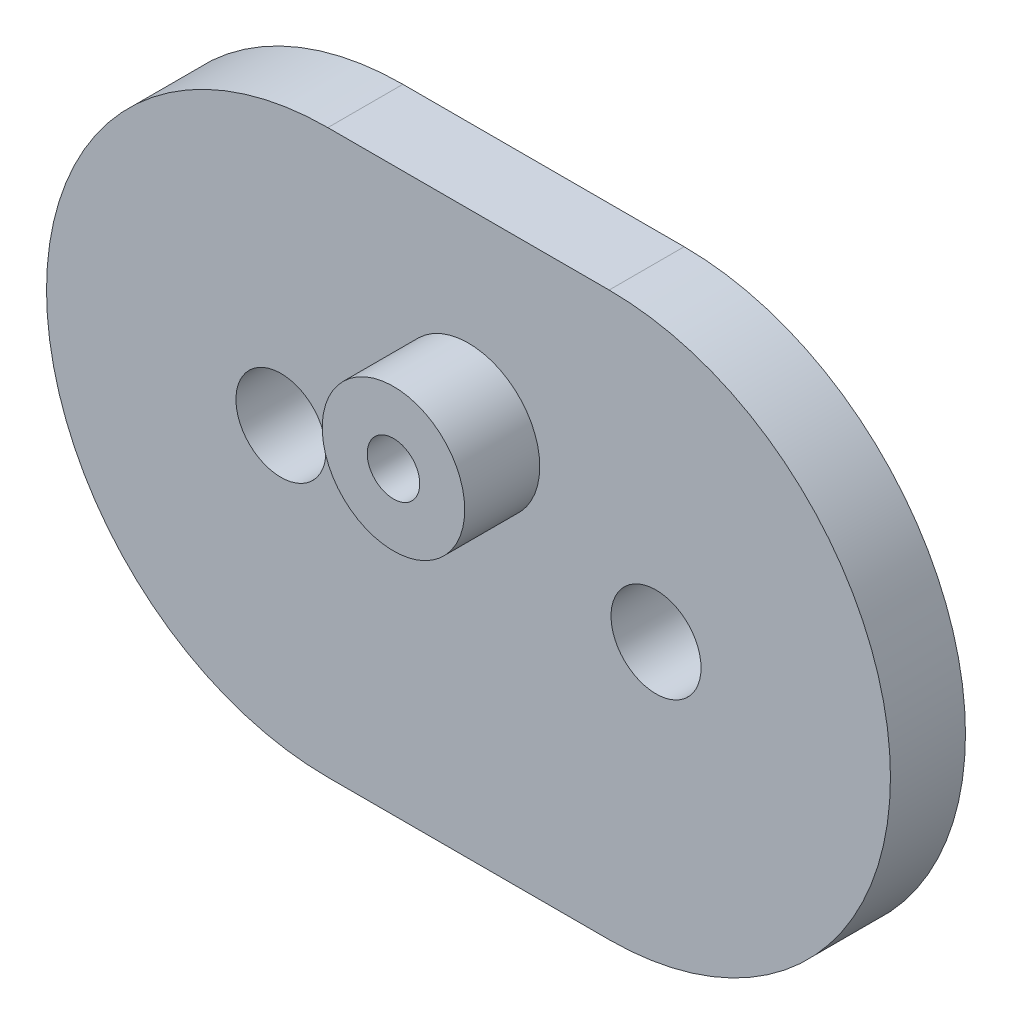
ISO-10303-21;
HEADER;
FILE_DESCRIPTION(('STEP AP214'),'2;1');
FILE_NAME('part.step','',(''),(''),'','','');
FILE_SCHEMA(('AUTOMOTIVE_DESIGN { 1 0 10303 214 1 1 1 1 }'));
ENDSEC;
DATA;
#1=APPLICATION_CONTEXT('core data for automotive mechanical design processes');
#2=APPLICATION_PROTOCOL_DEFINITION('international standard','automotive_design',2000,#1);
#3=PRODUCT_CONTEXT('',#1,'mechanical');
#4=PRODUCT('Part','Part','',(#3));
#5=PRODUCT_RELATED_PRODUCT_CATEGORY('part','',(#4));
#6=PRODUCT_DEFINITION_FORMATION('','',#4);
#7=PRODUCT_DEFINITION_CONTEXT('part definition',#1,'design');
#8=PRODUCT_DEFINITION('design','',#6,#7);
#9=PRODUCT_DEFINITION_SHAPE('','',#8);
#10=(LENGTH_UNIT() NAMED_UNIT(*) SI_UNIT(.MILLI.,.METRE.));
#11=(NAMED_UNIT(*) PLANE_ANGLE_UNIT() SI_UNIT($,.RADIAN.));
#12=(NAMED_UNIT(*) SI_UNIT($,.STERADIAN.) SOLID_ANGLE_UNIT());
#13=UNCERTAINTY_MEASURE_WITH_UNIT(LENGTH_MEASURE(1.E-05),#10,'distance_accuracy_value','');
#14=(GEOMETRIC_REPRESENTATION_CONTEXT(3) GLOBAL_UNCERTAINTY_ASSIGNED_CONTEXT((#13)) GLOBAL_UNIT_ASSIGNED_CONTEXT((#10,
#11,#12)) REPRESENTATION_CONTEXT('',''));
#15=CARTESIAN_POINT('',(0.,0.,0.));
#16=DIRECTION('',(0.,0.,1.));
#17=DIRECTION('',(1.,0.,0.));
#18=AXIS2_PLACEMENT_3D('',#15,#16,#17);
#19=CARTESIAN_POINT('',(0.,-15.,4.));
#20=DIRECTION('',(0.,1.,0.));
#21=DIRECTION('',(0.,0.,1.));
#22=AXIS2_PLACEMENT_3D('',#19,#20,#21);
#23=PLANE('',#22);
#24=DIRECTION('',(1.,0.,0.));
#25=VECTOR('',#24,1.);
#26=CARTESIAN_POINT('',(0.,-15.,0.));
#27=LINE('',#26,#25);
#28=CARTESIAN_POINT('',(-7.5,-15.,0.));
#29=VERTEX_POINT('',#28);
#30=CARTESIAN_POINT('',(7.5,-15.,0.));
#31=VERTEX_POINT('',#30);
#32=EDGE_CURVE('E105',#29,#31,#27,.T.);
#33=ORIENTED_EDGE('',*,*,#32,.T.);
#34=DIRECTION('',(0.,0.,-1.));
#35=VECTOR('',#34,1.);
#36=CARTESIAN_POINT('',(7.5,-15.,4.));
#37=LINE('',#36,#35);
#38=CARTESIAN_POINT('',(7.5,-15.,4.));
#39=VERTEX_POINT('',#38);
#40=EDGE_CURVE('E11',#39,#31,#37,.T.);
#41=ORIENTED_EDGE('',*,*,#40,.F.);
#42=DIRECTION('',(1.,0.,0.));
#43=VECTOR('',#42,1.);
#44=CARTESIAN_POINT('',(0.,-15.,4.));
#45=LINE('',#44,#43);
#46=CARTESIAN_POINT('',(-7.5,-15.,4.));
#47=VERTEX_POINT('',#46);
#48=EDGE_CURVE('E83',#47,#39,#45,.T.);
#49=ORIENTED_EDGE('',*,*,#48,.F.);
#50=DIRECTION('',(0.,0.,-1.));
#51=VECTOR('',#50,1.);
#52=CARTESIAN_POINT('',(-7.5,-15.,4.));
#53=LINE('',#52,#51);
#54=EDGE_CURVE('E94',#47,#29,#53,.T.);
#55=ORIENTED_EDGE('',*,*,#54,.T.);
#56=EDGE_LOOP('',(#33,#41,#49,#55));
#57=FACE_BOUND('',#56,.T.);
#58=ADVANCED_FACE('F35',(#57),#23,.F.);
#59=CARTESIAN_POINT('',(7.5,0.,4.));
#60=DIRECTION('',(0.,0.,-1.));
#61=DIRECTION('',(-1.,0.,0.));
#62=AXIS2_PLACEMENT_3D('',#59,#60,#61);
#63=CYLINDRICAL_SURFACE('',#62,15.);
#64=CARTESIAN_POINT('',(7.5,0.,0.));
#65=DIRECTION('',(0.,0.,1.));
#66=DIRECTION('',(1.,0.,0.));
#67=AXIS2_PLACEMENT_3D('',#64,#65,#66);
#68=CIRCLE('',#67,15.);
#69=CARTESIAN_POINT('',(7.5,15.,0.));
#70=VERTEX_POINT('',#69);
#71=EDGE_CURVE('E88',#31,#70,#68,.T.);
#72=ORIENTED_EDGE('',*,*,#71,.T.);
#73=DIRECTION('',(0.,0.,-1.));
#74=VECTOR('',#73,1.);
#75=CARTESIAN_POINT('',(7.5,15.,4.));
#76=LINE('',#75,#74);
#77=CARTESIAN_POINT('',(7.5,15.,4.));
#78=VERTEX_POINT('',#77);
#79=EDGE_CURVE('E44',#78,#70,#76,.T.);
#80=ORIENTED_EDGE('',*,*,#79,.F.);
#81=CARTESIAN_POINT('',(7.5,0.,4.));
#82=DIRECTION('',(0.,0.,1.));
#83=DIRECTION('',(1.,0.,0.));
#84=AXIS2_PLACEMENT_3D('',#81,#82,#83);
#85=CIRCLE('',#84,15.);
#86=EDGE_CURVE('E78',#39,#78,#85,.T.);
#87=ORIENTED_EDGE('',*,*,#86,.F.);
#88=ORIENTED_EDGE('',*,*,#40,.T.);
#89=EDGE_LOOP('',(#72,#80,#87,#88));
#90=FACE_BOUND('',#89,.T.);
#91=ADVANCED_FACE('F87',(#90),#63,.T.);
#92=CARTESIAN_POINT('',(0.,15.,4.));
#93=DIRECTION('',(0.,1.,0.));
#94=DIRECTION('',(0.,0.,1.));
#95=AXIS2_PLACEMENT_3D('',#92,#93,#94);
#96=PLANE('',#95);
#97=DIRECTION('',(1.,0.,0.));
#98=VECTOR('',#97,1.);
#99=CARTESIAN_POINT('',(0.,15.,0.));
#100=LINE('',#99,#98);
#101=CARTESIAN_POINT('',(-7.5,15.,0.));
#102=VERTEX_POINT('',#101);
#103=EDGE_CURVE('E109',#102,#70,#100,.T.);
#104=ORIENTED_EDGE('',*,*,#103,.F.);
#105=DIRECTION('',(0.,0.,-1.));
#106=VECTOR('',#105,1.);
#107=CARTESIAN_POINT('',(-7.5,15.,4.));
#108=LINE('',#107,#106);
#109=CARTESIAN_POINT('',(-7.5,15.,4.));
#110=VERTEX_POINT('',#109);
#111=EDGE_CURVE('E68',#110,#102,#108,.T.);
#112=ORIENTED_EDGE('',*,*,#111,.F.);
#113=DIRECTION('',(1.,0.,0.));
#114=VECTOR('',#113,1.);
#115=CARTESIAN_POINT('',(0.,15.,4.));
#116=LINE('',#115,#114);
#117=EDGE_CURVE('E81',#110,#78,#116,.T.);
#118=ORIENTED_EDGE('',*,*,#117,.T.);
#119=ORIENTED_EDGE('',*,*,#79,.T.);
#120=EDGE_LOOP('',(#104,#112,#118,#119));
#121=FACE_BOUND('',#120,.T.);
#122=ADVANCED_FACE('F92',(#121),#96,.T.);
#123=CARTESIAN_POINT('',(-10.,0.,4.));
#124=DIRECTION('',(0.,0.,-1.));
#125=DIRECTION('',(-1.,0.,0.));
#126=AXIS2_PLACEMENT_3D('',#123,#124,#125);
#127=CYLINDRICAL_SURFACE('',#126,2.4);
#128=CARTESIAN_POINT('',(-10.,0.,4.));
#129=DIRECTION('',(0.,0.,1.));
#130=DIRECTION('',(1.,0.,0.));
#131=AXIS2_PLACEMENT_3D('',#128,#129,#130);
#132=CIRCLE('',#131,2.4);
#133=CARTESIAN_POINT('',(-7.6,0.,4.));
#134=VERTEX_POINT('',#133);
#135=EDGE_CURVE('E138',#134,#134,#132,.T.);
#136=ORIENTED_EDGE('',*,*,#135,.T.);
#137=EDGE_LOOP('',(#136));
#138=FACE_BOUND('',#137,.T.);
#139=CARTESIAN_POINT('',(-10.,0.,0.));
#140=DIRECTION('',(0.,0.,1.));
#141=DIRECTION('',(1.,0.,0.));
#142=AXIS2_PLACEMENT_3D('',#139,#140,#141);
#143=CIRCLE('',#142,2.4);
#144=CARTESIAN_POINT('',(-7.6,0.,0.));
#145=VERTEX_POINT('',#144);
#146=EDGE_CURVE('E101',#145,#145,#143,.T.);
#147=ORIENTED_EDGE('',*,*,#146,.F.);
#148=EDGE_LOOP('',(#147));
#149=FACE_BOUND('',#148,.T.);
#150=ADVANCED_FACE('F142',(#138,#149),#127,.F.);
#151=CARTESIAN_POINT('',(10.,0.,4.));
#152=DIRECTION('',(0.,0.,-1.));
#153=DIRECTION('',(-1.,0.,0.));
#154=AXIS2_PLACEMENT_3D('',#151,#152,#153);
#155=CYLINDRICAL_SURFACE('',#154,2.4);
#156=CARTESIAN_POINT('',(10.,0.,4.));
#157=DIRECTION('',(0.,0.,1.));
#158=DIRECTION('',(1.,0.,0.));
#159=AXIS2_PLACEMENT_3D('',#156,#157,#158);
#160=CIRCLE('',#159,2.4);
#161=CARTESIAN_POINT('',(12.4,0.,4.));
#162=VERTEX_POINT('',#161);
#163=EDGE_CURVE('E135',#162,#162,#160,.T.);
#164=ORIENTED_EDGE('',*,*,#163,.T.);
#165=EDGE_LOOP('',(#164));
#166=FACE_BOUND('',#165,.T.);
#167=CARTESIAN_POINT('',(10.,0.,0.));
#168=DIRECTION('',(0.,0.,1.));
#169=DIRECTION('',(1.,0.,0.));
#170=AXIS2_PLACEMENT_3D('',#167,#168,#169);
#171=CIRCLE('',#170,2.4);
#172=CARTESIAN_POINT('',(12.4,0.,0.));
#173=VERTEX_POINT('',#172);
#174=EDGE_CURVE('E98',#173,#173,#171,.T.);
#175=ORIENTED_EDGE('',*,*,#174,.F.);
#176=EDGE_LOOP('',(#175));
#177=FACE_BOUND('',#176,.T.);
#178=ADVANCED_FACE('F37',(#166,#177),#155,.F.);
#179=CARTESIAN_POINT('',(-7.5,0.,4.));
#180=DIRECTION('',(0.,0.,-1.));
#181=DIRECTION('',(-1.,0.,0.));
#182=AXIS2_PLACEMENT_3D('',#179,#180,#181);
#183=CYLINDRICAL_SURFACE('',#182,15.);
#184=CARTESIAN_POINT('',(-7.5,0.,0.));
#185=DIRECTION('',(0.,0.,1.));
#186=DIRECTION('',(1.,0.,0.));
#187=AXIS2_PLACEMENT_3D('',#184,#185,#186);
#188=CIRCLE('',#187,15.);
#189=EDGE_CURVE('E71',#102,#29,#188,.T.);
#190=ORIENTED_EDGE('',*,*,#189,.T.);
#191=ORIENTED_EDGE('',*,*,#54,.F.);
#192=CARTESIAN_POINT('',(-7.5,0.,4.));
#193=DIRECTION('',(0.,0.,1.));
#194=DIRECTION('',(1.,0.,0.));
#195=AXIS2_PLACEMENT_3D('',#192,#193,#194);
#196=CIRCLE('',#195,15.);
#197=EDGE_CURVE('E52',#110,#47,#196,.T.);
#198=ORIENTED_EDGE('',*,*,#197,.F.);
#199=ORIENTED_EDGE('',*,*,#111,.T.);
#200=EDGE_LOOP('',(#190,#191,#198,#199));
#201=FACE_BOUND('',#200,.T.);
#202=ADVANCED_FACE('F146',(#201),#183,.T.);
#203=CARTESIAN_POINT('',(0.,0.,4.));
#204=DIRECTION('',(0.,0.,1.));
#205=DIRECTION('',(1.,0.,0.));
#206=AXIS2_PLACEMENT_3D('',#203,#204,#205);
#207=PLANE('',#206);
#208=CARTESIAN_POINT('',(0.,5.,4.));
#209=DIRECTION('',(0.,0.,1.));
#210=DIRECTION('',(1.,0.,0.));
#211=AXIS2_PLACEMENT_3D('',#208,#209,#210);
#212=CIRCLE('',#211,3.8);
#213=CARTESIAN_POINT('',(3.8,5.,4.));
#214=VERTEX_POINT('',#213);
#215=EDGE_CURVE('E112',#214,#214,#212,.T.);
#216=ORIENTED_EDGE('',*,*,#215,.F.);
#217=EDGE_LOOP('',(#216));
#218=FACE_BOUND('',#217,.T.);
#219=ORIENTED_EDGE('',*,*,#163,.F.);
#220=EDGE_LOOP('',(#219));
#221=FACE_BOUND('',#220,.T.);
#222=ORIENTED_EDGE('',*,*,#135,.F.);
#223=EDGE_LOOP('',(#222));
#224=FACE_BOUND('',#223,.T.);
#225=ORIENTED_EDGE('',*,*,#48,.T.);
#226=ORIENTED_EDGE('',*,*,#86,.T.);
#227=ORIENTED_EDGE('',*,*,#117,.F.);
#228=ORIENTED_EDGE('',*,*,#197,.T.);
#229=EDGE_LOOP('',(#225,#226,#227,#228));
#230=FACE_BOUND('',#229,.T.);
#231=ADVANCED_FACE('F79',(#218,#221,#224,#230),#207,.T.);
#232=CARTESIAN_POINT('',(0.,0.,0.));
#233=DIRECTION('',(0.,0.,1.));
#234=DIRECTION('',(1.,0.,0.));
#235=AXIS2_PLACEMENT_3D('',#232,#233,#234);
#236=PLANE('',#235);
#237=ORIENTED_EDGE('',*,*,#174,.T.);
#238=EDGE_LOOP('',(#237));
#239=FACE_BOUND('',#238,.T.);
#240=ORIENTED_EDGE('',*,*,#146,.T.);
#241=EDGE_LOOP('',(#240));
#242=FACE_BOUND('',#241,.T.);
#243=ORIENTED_EDGE('',*,*,#32,.F.);
#244=ORIENTED_EDGE('',*,*,#189,.F.);
#245=ORIENTED_EDGE('',*,*,#103,.T.);
#246=ORIENTED_EDGE('',*,*,#71,.F.);
#247=EDGE_LOOP('',(#243,#244,#245,#246));
#248=FACE_BOUND('',#247,.T.);
#249=CARTESIAN_POINT('',(0.,5.,0.));
#250=DIRECTION('',(0.,0.,1.));
#251=DIRECTION('',(1.,0.,0.));
#252=AXIS2_PLACEMENT_3D('',#249,#250,#251);
#253=CIRCLE('',#252,1.4);
#254=CARTESIAN_POINT('',(1.4,5.,0.));
#255=VERTEX_POINT('',#254);
#256=EDGE_CURVE('E125',#255,#255,#253,.T.);
#257=ORIENTED_EDGE('',*,*,#256,.T.);
#258=EDGE_LOOP('',(#257));
#259=FACE_BOUND('',#258,.T.);
#260=ADVANCED_FACE('F117',(#239,#242,#248,#259),#236,.F.);
#261=CARTESIAN_POINT('',(0.,5.,8.));
#262=DIRECTION('',(0.,0.,-1.));
#263=DIRECTION('',(-1.,0.,0.));
#264=AXIS2_PLACEMENT_3D('',#261,#262,#263);
#265=CYLINDRICAL_SURFACE('',#264,1.4);
#266=CARTESIAN_POINT('',(0.,5.,8.));
#267=DIRECTION('',(0.,0.,1.));
#268=DIRECTION('',(1.,0.,0.));
#269=AXIS2_PLACEMENT_3D('',#266,#267,#268);
#270=CIRCLE('',#269,1.4);
#271=CARTESIAN_POINT('',(1.4,5.,8.));
#272=VERTEX_POINT('',#271);
#273=EDGE_CURVE('E127',#272,#272,#270,.T.);
#274=ORIENTED_EDGE('',*,*,#273,.T.);
#275=EDGE_LOOP('',(#274));
#276=FACE_BOUND('',#275,.T.);
#277=ORIENTED_EDGE('',*,*,#256,.F.);
#278=EDGE_LOOP('',(#277));
#279=FACE_BOUND('',#278,.T.);
#280=ADVANCED_FACE('F120',(#276,#279),#265,.F.);
#281=CARTESIAN_POINT('',(0.,5.,8.));
#282=DIRECTION('',(0.,0.,-1.));
#283=DIRECTION('',(-1.,0.,0.));
#284=AXIS2_PLACEMENT_3D('',#281,#282,#283);
#285=CYLINDRICAL_SURFACE('',#284,3.8);
#286=ORIENTED_EDGE('',*,*,#215,.T.);
#287=EDGE_LOOP('',(#286));
#288=FACE_BOUND('',#287,.T.);
#289=CARTESIAN_POINT('',(0.,5.,8.));
#290=DIRECTION('',(0.,0.,1.));
#291=DIRECTION('',(1.,0.,0.));
#292=AXIS2_PLACEMENT_3D('',#289,#290,#291);
#293=CIRCLE('',#292,3.8);
#294=CARTESIAN_POINT('',(3.8,5.,8.));
#295=VERTEX_POINT('',#294);
#296=EDGE_CURVE('E102',#295,#295,#293,.T.);
#297=ORIENTED_EDGE('',*,*,#296,.F.);
#298=EDGE_LOOP('',(#297));
#299=FACE_BOUND('',#298,.T.);
#300=ADVANCED_FACE('F217',(#288,#299),#285,.T.);
#301=CARTESIAN_POINT('',(0.,0.,8.));
#302=DIRECTION('',(0.,0.,1.));
#303=DIRECTION('',(1.,0.,0.));
#304=AXIS2_PLACEMENT_3D('',#301,#302,#303);
#305=PLANE('',#304);
#306=ORIENTED_EDGE('',*,*,#273,.F.);
#307=EDGE_LOOP('',(#306));
#308=FACE_BOUND('',#307,.T.);
#309=ORIENTED_EDGE('',*,*,#296,.T.);
#310=EDGE_LOOP('',(#309));
#311=FACE_BOUND('',#310,.T.);
#312=ADVANCED_FACE('F225',(#308,#311),#305,.T.);
#313=CLOSED_SHELL('',(#58,#91,#122,#150,#178,#202,#231,#260,#280,#300,#312));
#314=MANIFOLD_SOLID_BREP('B2',#313);
#315=ADVANCED_BREP_SHAPE_REPRESENTATION('',(#18,#314),#14);
#316=SHAPE_DEFINITION_REPRESENTATION(#9,#315);
ENDSEC;
END-ISO-10303-21;
